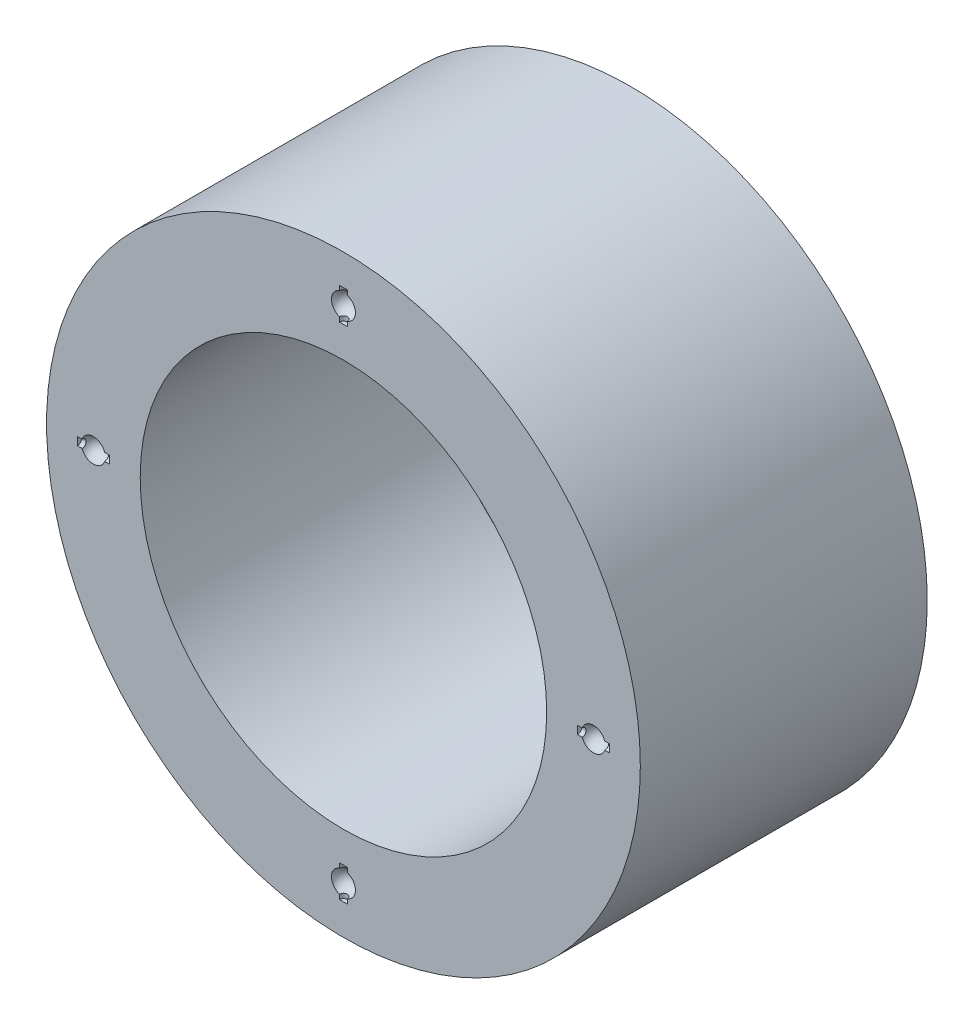
ISO-10303-21;
HEADER;
FILE_DESCRIPTION(('STEP AP214'),'2;1');
FILE_NAME('part.step','',(''),(''),'','','');
FILE_SCHEMA(('AUTOMOTIVE_DESIGN { 1 0 10303 214 1 1 1 1 }'));
ENDSEC;
DATA;
#1=APPLICATION_CONTEXT('core data for automotive mechanical design processes');
#2=APPLICATION_PROTOCOL_DEFINITION('international standard','automotive_design',2000,#1);
#3=PRODUCT_CONTEXT('',#1,'mechanical');
#4=PRODUCT('Part','Part','',(#3));
#5=PRODUCT_RELATED_PRODUCT_CATEGORY('part','',(#4));
#6=PRODUCT_DEFINITION_FORMATION('','',#4);
#7=PRODUCT_DEFINITION_CONTEXT('part definition',#1,'design');
#8=PRODUCT_DEFINITION('design','',#6,#7);
#9=PRODUCT_DEFINITION_SHAPE('','',#8);
#10=(LENGTH_UNIT() NAMED_UNIT(*) SI_UNIT(.MILLI.,.METRE.));
#11=(NAMED_UNIT(*) PLANE_ANGLE_UNIT() SI_UNIT($,.RADIAN.));
#12=(NAMED_UNIT(*) SI_UNIT($,.STERADIAN.) SOLID_ANGLE_UNIT());
#13=UNCERTAINTY_MEASURE_WITH_UNIT(LENGTH_MEASURE(1.E-05),#10,'distance_accuracy_value','');
#14=(GEOMETRIC_REPRESENTATION_CONTEXT(3) GLOBAL_UNCERTAINTY_ASSIGNED_CONTEXT((#13)) GLOBAL_UNIT_ASSIGNED_CONTEXT((#10,
#11,#12)) REPRESENTATION_CONTEXT('',''));
#15=CARTESIAN_POINT('',(0.,0.,0.));
#16=DIRECTION('',(0.,0.,1.));
#17=DIRECTION('',(1.,0.,0.));
#18=AXIS2_PLACEMENT_3D('',#15,#16,#17);
#19=CARTESIAN_POINT('',(0.,0.,72.));
#20=DIRECTION('',(0.,0.,-1.));
#21=DIRECTION('',(-1.,0.,0.));
#22=AXIS2_PLACEMENT_3D('',#19,#20,#21);
#23=CYLINDRICAL_SURFACE('',#22,74.5);
#24=CARTESIAN_POINT('',(0.,0.,72.));
#25=DIRECTION('',(0.,0.,1.));
#26=DIRECTION('',(1.,0.,0.));
#27=AXIS2_PLACEMENT_3D('',#24,#25,#26);
#28=CIRCLE('',#27,74.5);
#29=CARTESIAN_POINT('',(74.5,0.,72.));
#30=VERTEX_POINT('',#29);
#31=EDGE_CURVE('E197',#30,#30,#28,.T.);
#32=ORIENTED_EDGE('',*,*,#31,.F.);
#33=EDGE_LOOP('',(#32));
#34=FACE_BOUND('',#33,.T.);
#35=CARTESIAN_POINT('',(0.,0.,0.));
#36=DIRECTION('',(0.,0.,1.));
#37=DIRECTION('',(1.,0.,0.));
#38=AXIS2_PLACEMENT_3D('',#35,#36,#37);
#39=CIRCLE('',#38,74.5);
#40=CARTESIAN_POINT('',(74.5,0.,0.));
#41=VERTEX_POINT('',#40);
#42=EDGE_CURVE('E213',#41,#41,#39,.T.);
#43=ORIENTED_EDGE('',*,*,#42,.T.);
#44=EDGE_LOOP('',(#43));
#45=FACE_BOUND('',#44,.T.);
#46=ADVANCED_FACE('F33',(#34,#45),#23,.T.);
#47=CARTESIAN_POINT('',(0.,0.,72.));
#48=DIRECTION('',(0.,0.,1.));
#49=DIRECTION('',(1.,0.,0.));
#50=AXIS2_PLACEMENT_3D('',#47,#48,#49);
#51=PLANE('',#50);
#52=DIRECTION('',(1.,0.,0.));
#53=VECTOR('',#52,1.);
#54=CARTESIAN_POINT('',(-58.75,-1.,72.));
#55=LINE('',#54,#53);
#56=CARTESIAN_POINT('',(-59.9215728752538,-1.00000000000001,72.));
#57=VERTEX_POINT('',#56);
#58=CARTESIAN_POINT('',(-58.75,-1.,72.));
#59=VERTEX_POINT('',#58);
#60=EDGE_CURVE('E260',#57,#59,#55,.T.);
#61=ORIENTED_EDGE('',*,*,#60,.F.);
#62=CARTESIAN_POINT('',(-62.75,0.,72.));
#63=DIRECTION('',(0.,0.,1.));
#64=DIRECTION('',(1.,0.,0.));
#65=AXIS2_PLACEMENT_3D('',#62,#63,#64);
#66=CIRCLE('',#65,3.);
#67=CARTESIAN_POINT('',(-65.5784271247462,-0.999999999999992,72.));
#68=VERTEX_POINT('',#67);
#69=EDGE_CURVE('E198',#57,#68,#66,.F.);
#70=ORIENTED_EDGE('',*,*,#69,.T.);
#71=CARTESIAN_POINT('',(-66.75,-1.,72.));
#72=VERTEX_POINT('',#71);
#73=EDGE_CURVE('E55',#72,#68,#55,.T.);
#74=ORIENTED_EDGE('',*,*,#73,.F.);
#75=DIRECTION('',(0.,1.,0.));
#76=VECTOR('',#75,1.);
#77=CARTESIAN_POINT('',(-66.75,0.,72.));
#78=LINE('',#77,#76);
#79=CARTESIAN_POINT('',(-66.75,0.999999999999999,72.));
#80=VERTEX_POINT('',#79);
#81=EDGE_CURVE('E40',#72,#80,#78,.T.);
#82=ORIENTED_EDGE('',*,*,#81,.T.);
#83=DIRECTION('',(1.,0.,0.));
#84=VECTOR('',#83,1.);
#85=CARTESIAN_POINT('',(-58.75,1.,72.));
#86=LINE('',#85,#84);
#87=CARTESIAN_POINT('',(-65.5784271247462,0.999999999999989,72.));
#88=VERTEX_POINT('',#87);
#89=EDGE_CURVE('E145',#88,#80,#86,.F.);
#90=ORIENTED_EDGE('',*,*,#89,.F.);
#91=CARTESIAN_POINT('',(-59.9215728752538,1.00000000000001,72.));
#92=VERTEX_POINT('',#91);
#93=EDGE_CURVE('E201',#88,#92,#66,.F.);
#94=ORIENTED_EDGE('',*,*,#93,.T.);
#95=CARTESIAN_POINT('',(-58.75,1.,72.));
#96=VERTEX_POINT('',#95);
#97=EDGE_CURVE('E47',#96,#92,#86,.F.);
#98=ORIENTED_EDGE('',*,*,#97,.F.);
#99=DIRECTION('',(0.,-1.,0.));
#100=VECTOR('',#99,1.);
#101=CARTESIAN_POINT('',(-58.75,0.,72.));
#102=LINE('',#101,#100);
#103=EDGE_CURVE('E11',#96,#59,#102,.T.);
#104=ORIENTED_EDGE('',*,*,#103,.T.);
#105=EDGE_LOOP('',(#61,#70,#74,#82,#90,#94,#98,#104));
#106=FACE_BOUND('',#105,.T.);
#107=DIRECTION('',(-1.,0.,0.));
#108=VECTOR('',#107,1.);
#109=CARTESIAN_POINT('',(58.75,1.,72.));
#110=LINE('',#109,#108);
#111=CARTESIAN_POINT('',(59.9215728752538,1.,72.));
#112=VERTEX_POINT('',#111);
#113=CARTESIAN_POINT('',(58.75,1.,72.));
#114=VERTEX_POINT('',#113);
#115=EDGE_CURVE('E248',#112,#114,#110,.T.);
#116=ORIENTED_EDGE('',*,*,#115,.F.);
#117=CARTESIAN_POINT('',(62.75,0.,72.));
#118=DIRECTION('',(0.,0.,1.));
#119=DIRECTION('',(1.,0.,0.));
#120=AXIS2_PLACEMENT_3D('',#117,#118,#119);
#121=CIRCLE('',#120,3.);
#122=CARTESIAN_POINT('',(65.5784271247462,1.,72.));
#123=VERTEX_POINT('',#122);
#124=EDGE_CURVE('E200',#112,#123,#121,.F.);
#125=ORIENTED_EDGE('',*,*,#124,.T.);
#126=CARTESIAN_POINT('',(66.75,1.,72.));
#127=VERTEX_POINT('',#126);
#128=EDGE_CURVE('E249',#127,#123,#110,.T.);
#129=ORIENTED_EDGE('',*,*,#128,.F.);
#130=DIRECTION('',(0.,-1.,0.));
#131=VECTOR('',#130,1.);
#132=CARTESIAN_POINT('',(66.75,0.,72.));
#133=LINE('',#132,#131);
#134=CARTESIAN_POINT('',(66.75,-1.,72.));
#135=VERTEX_POINT('',#134);
#136=EDGE_CURVE('E170',#127,#135,#133,.T.);
#137=ORIENTED_EDGE('',*,*,#136,.T.);
#138=DIRECTION('',(-1.,0.,0.));
#139=VECTOR('',#138,1.);
#140=CARTESIAN_POINT('',(58.75,-1.,72.));
#141=LINE('',#140,#139);
#142=CARTESIAN_POINT('',(65.5784271247462,-1.,72.));
#143=VERTEX_POINT('',#142);
#144=EDGE_CURVE('E252',#143,#135,#141,.F.);
#145=ORIENTED_EDGE('',*,*,#144,.F.);
#146=CARTESIAN_POINT('',(59.9215728752538,-1.,72.));
#147=VERTEX_POINT('',#146);
#148=EDGE_CURVE('E202',#143,#147,#121,.F.);
#149=ORIENTED_EDGE('',*,*,#148,.T.);
#150=CARTESIAN_POINT('',(58.75,-1.,72.));
#151=VERTEX_POINT('',#150);
#152=EDGE_CURVE('E251',#151,#147,#141,.F.);
#153=ORIENTED_EDGE('',*,*,#152,.F.);
#154=DIRECTION('',(0.,1.,0.));
#155=VECTOR('',#154,1.);
#156=CARTESIAN_POINT('',(58.75,0.,72.));
#157=LINE('',#156,#155);
#158=EDGE_CURVE('E167',#151,#114,#157,.T.);
#159=ORIENTED_EDGE('',*,*,#158,.T.);
#160=EDGE_LOOP('',(#116,#125,#129,#137,#145,#149,#153,#159));
#161=FACE_BOUND('',#160,.T.);
#162=DIRECTION('',(0.,1.,0.));
#163=VECTOR('',#162,1.);
#164=CARTESIAN_POINT('',(1.,-58.75,72.));
#165=LINE('',#164,#163);
#166=CARTESIAN_POINT('',(1.,-59.9215728752538,72.));
#167=VERTEX_POINT('',#166);
#168=CARTESIAN_POINT('',(1.,-58.75,72.));
#169=VERTEX_POINT('',#168);
#170=EDGE_CURVE('E236',#167,#169,#165,.T.);
#171=ORIENTED_EDGE('',*,*,#170,.F.);
#172=CARTESIAN_POINT('',(0.,-62.75,72.));
#173=DIRECTION('',(0.,0.,1.));
#174=DIRECTION('',(1.,0.,0.));
#175=AXIS2_PLACEMENT_3D('',#172,#173,#174);
#176=CIRCLE('',#175,3.);
#177=CARTESIAN_POINT('',(1.,-65.5784271247462,72.));
#178=VERTEX_POINT('',#177);
#179=EDGE_CURVE('E205',#167,#178,#176,.F.);
#180=ORIENTED_EDGE('',*,*,#179,.T.);
#181=CARTESIAN_POINT('',(1.,-66.75,72.));
#182=VERTEX_POINT('',#181);
#183=EDGE_CURVE('E237',#182,#178,#165,.T.);
#184=ORIENTED_EDGE('',*,*,#183,.F.);
#185=DIRECTION('',(-1.,0.,0.));
#186=VECTOR('',#185,1.);
#187=CARTESIAN_POINT('',(0.,-66.75,72.));
#188=LINE('',#187,#186);
#189=CARTESIAN_POINT('',(-0.999999999999999,-66.75,72.));
#190=VERTEX_POINT('',#189);
#191=EDGE_CURVE('E180',#182,#190,#188,.T.);
#192=ORIENTED_EDGE('',*,*,#191,.T.);
#193=DIRECTION('',(0.,1.,0.));
#194=VECTOR('',#193,1.);
#195=CARTESIAN_POINT('',(-1.,-58.75,72.));
#196=LINE('',#195,#194);
#197=CARTESIAN_POINT('',(-0.999999999999999,-65.5784271247462,72.));
#198=VERTEX_POINT('',#197);
#199=EDGE_CURVE('E240',#198,#190,#196,.F.);
#200=ORIENTED_EDGE('',*,*,#199,.F.);
#201=CARTESIAN_POINT('',(-1.,-59.9215728752538,72.));
#202=VERTEX_POINT('',#201);
#203=EDGE_CURVE('E208',#198,#202,#176,.F.);
#204=ORIENTED_EDGE('',*,*,#203,.T.);
#205=CARTESIAN_POINT('',(-1.,-58.75,72.));
#206=VERTEX_POINT('',#205);
#207=EDGE_CURVE('E239',#206,#202,#196,.F.);
#208=ORIENTED_EDGE('',*,*,#207,.F.);
#209=DIRECTION('',(1.,0.,0.));
#210=VECTOR('',#209,1.);
#211=CARTESIAN_POINT('',(0.,-58.75,72.));
#212=LINE('',#211,#210);
#213=EDGE_CURVE('E177',#206,#169,#212,.T.);
#214=ORIENTED_EDGE('',*,*,#213,.T.);
#215=EDGE_LOOP('',(#171,#180,#184,#192,#200,#204,#208,#214));
#216=FACE_BOUND('',#215,.T.);
#217=DIRECTION('',(0.,1.,0.));
#218=VECTOR('',#217,1.);
#219=CARTESIAN_POINT('',(1.,66.75,72.));
#220=LINE('',#219,#218);
#221=CARTESIAN_POINT('',(1.,65.5784271247462,72.));
#222=VERTEX_POINT('',#221);
#223=CARTESIAN_POINT('',(1.,66.75,72.));
#224=VERTEX_POINT('',#223);
#225=EDGE_CURVE('E228',#222,#224,#220,.T.);
#226=ORIENTED_EDGE('',*,*,#225,.F.);
#227=CARTESIAN_POINT('',(0.,62.75,72.));
#228=DIRECTION('',(0.,0.,1.));
#229=DIRECTION('',(1.,0.,0.));
#230=AXIS2_PLACEMENT_3D('',#227,#228,#229);
#231=CIRCLE('',#230,3.);
#232=CARTESIAN_POINT('',(1.,59.9215728752538,72.));
#233=VERTEX_POINT('',#232);
#234=EDGE_CURVE('E209',#222,#233,#231,.F.);
#235=ORIENTED_EDGE('',*,*,#234,.T.);
#236=CARTESIAN_POINT('',(1.,58.75,72.));
#237=VERTEX_POINT('',#236);
#238=EDGE_CURVE('E224',#237,#233,#220,.T.);
#239=ORIENTED_EDGE('',*,*,#238,.F.);
#240=DIRECTION('',(-1.,0.,0.));
#241=VECTOR('',#240,1.);
#242=CARTESIAN_POINT('',(0.,58.75,72.));
#243=LINE('',#242,#241);
#244=CARTESIAN_POINT('',(-0.999999999999999,58.75,72.));
#245=VERTEX_POINT('',#244);
#246=EDGE_CURVE('E190',#237,#245,#243,.T.);
#247=ORIENTED_EDGE('',*,*,#246,.T.);
#248=DIRECTION('',(0.,1.,0.));
#249=VECTOR('',#248,1.);
#250=CARTESIAN_POINT('',(-1.,66.75,72.));
#251=LINE('',#250,#249);
#252=CARTESIAN_POINT('',(-1.,59.9215728752538,72.));
#253=VERTEX_POINT('',#252);
#254=EDGE_CURVE('E227',#253,#245,#251,.F.);
#255=ORIENTED_EDGE('',*,*,#254,.F.);
#256=CARTESIAN_POINT('',(-1.,65.5784271247462,72.));
#257=VERTEX_POINT('',#256);
#258=EDGE_CURVE('E212',#253,#257,#231,.F.);
#259=ORIENTED_EDGE('',*,*,#258,.T.);
#260=CARTESIAN_POINT('',(-1.,66.75,72.));
#261=VERTEX_POINT('',#260);
#262=EDGE_CURVE('E226',#261,#257,#251,.F.);
#263=ORIENTED_EDGE('',*,*,#262,.F.);
#264=DIRECTION('',(1.,0.,0.));
#265=VECTOR('',#264,1.);
#266=CARTESIAN_POINT('',(0.,66.75,72.));
#267=LINE('',#266,#265);
#268=EDGE_CURVE('E187',#261,#224,#267,.T.);
#269=ORIENTED_EDGE('',*,*,#268,.T.);
#270=EDGE_LOOP('',(#226,#235,#239,#247,#255,#259,#263,#269));
#271=FACE_BOUND('',#270,.T.);
#272=CARTESIAN_POINT('',(0.,0.,72.));
#273=DIRECTION('',(0.,0.,1.));
#274=DIRECTION('',(1.,0.,0.));
#275=AXIS2_PLACEMENT_3D('',#272,#273,#274);
#276=CIRCLE('',#275,51.);
#277=CARTESIAN_POINT('',(51.,0.,72.));
#278=VERTEX_POINT('',#277);
#279=EDGE_CURVE('E219',#278,#278,#276,.T.);
#280=ORIENTED_EDGE('',*,*,#279,.F.);
#281=EDGE_LOOP('',(#280));
#282=FACE_BOUND('',#281,.T.);
#283=ORIENTED_EDGE('',*,*,#31,.T.);
#284=EDGE_LOOP('',(#283));
#285=FACE_BOUND('',#284,.T.);
#286=ADVANCED_FACE('F160',(#106,#161,#216,#271,#282,#285),#51,.T.);
#287=CARTESIAN_POINT('',(0.,0.,0.));
#288=DIRECTION('',(0.,0.,1.));
#289=DIRECTION('',(1.,0.,0.));
#290=AXIS2_PLACEMENT_3D('',#287,#288,#289);
#291=PLANE('',#290);
#292=CARTESIAN_POINT('',(0.,0.,0.));
#293=DIRECTION('',(0.,0.,1.));
#294=DIRECTION('',(1.,0.,0.));
#295=AXIS2_PLACEMENT_3D('',#292,#293,#294);
#296=CIRCLE('',#295,51.);
#297=CARTESIAN_POINT('',(51.,0.,0.));
#298=VERTEX_POINT('',#297);
#299=EDGE_CURVE('E216',#298,#298,#296,.T.);
#300=ORIENTED_EDGE('',*,*,#299,.T.);
#301=EDGE_LOOP('',(#300));
#302=FACE_BOUND('',#301,.T.);
#303=ORIENTED_EDGE('',*,*,#42,.F.);
#304=EDGE_LOOP('',(#303));
#305=FACE_BOUND('',#304,.T.);
#306=ADVANCED_FACE('F303',(#302,#305),#291,.F.);
#307=CARTESIAN_POINT('',(0.,0.,0.));
#308=DIRECTION('',(0.,0.,1.));
#309=DIRECTION('',(1.,0.,0.));
#310=AXIS2_PLACEMENT_3D('',#307,#308,#309);
#311=CYLINDRICAL_SURFACE('',#310,51.);
#312=ORIENTED_EDGE('',*,*,#299,.F.);
#313=EDGE_LOOP('',(#312));
#314=FACE_BOUND('',#313,.T.);
#315=ORIENTED_EDGE('',*,*,#279,.T.);
#316=EDGE_LOOP('',(#315));
#317=FACE_BOUND('',#316,.T.);
#318=ADVANCED_FACE('F310',(#314,#317),#311,.F.);
#319=CARTESIAN_POINT('',(0.,62.75,72.));
#320=DIRECTION('',(0.,1.,0.));
#321=DIRECTION('',(1.,0.,0.));
#322=AXIS2_PLACEMENT_3D('',#319,#320,#321);
#323=SPHERICAL_SURFACE('',#322,3.);
#324=CARTESIAN_POINT('',(0.,65.5784271247462,72.));
#325=DIRECTION('',(0.,-1.,0.));
#326=DIRECTION('',(1.,0.,0.));
#327=AXIS2_PLACEMENT_3D('',#324,#325,#326);
#328=CIRCLE('',#327,1.);
#329=EDGE_CURVE('E193',#257,#222,#328,.T.);
#330=ORIENTED_EDGE('',*,*,#329,.F.);
#331=ORIENTED_EDGE('',*,*,#258,.F.);
#332=CARTESIAN_POINT('',(0.,59.9215728752538,72.));
#333=DIRECTION('',(0.,1.,0.));
#334=DIRECTION('',(-1.,0.,0.));
#335=AXIS2_PLACEMENT_3D('',#332,#333,#334);
#336=CIRCLE('',#335,1.);
#337=EDGE_CURVE('E195',#233,#253,#336,.T.);
#338=ORIENTED_EDGE('',*,*,#337,.F.);
#339=ORIENTED_EDGE('',*,*,#234,.F.);
#340=EDGE_LOOP('',(#330,#331,#338,#339));
#341=FACE_BOUND('',#340,.T.);
#342=ADVANCED_FACE('F277',(#341),#323,.F.);
#343=CARTESIAN_POINT('',(0.,-62.75,72.));
#344=DIRECTION('',(0.,1.,0.));
#345=DIRECTION('',(1.,0.,0.));
#346=AXIS2_PLACEMENT_3D('',#343,#344,#345);
#347=SPHERICAL_SURFACE('',#346,3.);
#348=CARTESIAN_POINT('',(0.,-59.9215728752538,72.));
#349=DIRECTION('',(0.,-1.,0.));
#350=DIRECTION('',(1.,0.,0.));
#351=AXIS2_PLACEMENT_3D('',#348,#349,#350);
#352=CIRCLE('',#351,1.);
#353=EDGE_CURVE('E183',#202,#167,#352,.T.);
#354=ORIENTED_EDGE('',*,*,#353,.F.);
#355=ORIENTED_EDGE('',*,*,#203,.F.);
#356=CARTESIAN_POINT('',(0.,-65.5784271247462,72.));
#357=DIRECTION('',(0.,1.,0.));
#358=DIRECTION('',(-1.,0.,0.));
#359=AXIS2_PLACEMENT_3D('',#356,#357,#358);
#360=CIRCLE('',#359,1.);
#361=EDGE_CURVE('E185',#178,#198,#360,.T.);
#362=ORIENTED_EDGE('',*,*,#361,.F.);
#363=ORIENTED_EDGE('',*,*,#179,.F.);
#364=EDGE_LOOP('',(#354,#355,#362,#363));
#365=FACE_BOUND('',#364,.T.);
#366=ADVANCED_FACE('F320',(#365),#347,.F.);
#367=CARTESIAN_POINT('',(62.75,0.,72.));
#368=DIRECTION('',(0.,1.,0.));
#369=DIRECTION('',(1.,0.,0.));
#370=AXIS2_PLACEMENT_3D('',#367,#368,#369);
#371=SPHERICAL_SURFACE('',#370,3.);
#372=CARTESIAN_POINT('',(59.9215728752538,0.,72.));
#373=DIRECTION('',(1.,0.,0.));
#374=DIRECTION('',(0.,0.,-1.));
#375=AXIS2_PLACEMENT_3D('',#372,#373,#374);
#376=CIRCLE('',#375,1.);
#377=EDGE_CURVE('E173',#147,#112,#376,.T.);
#378=ORIENTED_EDGE('',*,*,#377,.F.);
#379=ORIENTED_EDGE('',*,*,#148,.F.);
#380=CARTESIAN_POINT('',(65.5784271247462,0.,72.));
#381=DIRECTION('',(-1.,0.,0.));
#382=DIRECTION('',(0.,0.,1.));
#383=AXIS2_PLACEMENT_3D('',#380,#381,#382);
#384=CIRCLE('',#383,1.);
#385=EDGE_CURVE('E175',#123,#143,#384,.T.);
#386=ORIENTED_EDGE('',*,*,#385,.F.);
#387=ORIENTED_EDGE('',*,*,#124,.F.);
#388=EDGE_LOOP('',(#378,#379,#386,#387));
#389=FACE_BOUND('',#388,.T.);
#390=ADVANCED_FACE('F323',(#389),#371,.F.);
#391=CARTESIAN_POINT('',(-62.75,0.,72.));
#392=DIRECTION('',(0.,1.,0.));
#393=DIRECTION('',(1.,0.,0.));
#394=AXIS2_PLACEMENT_3D('',#391,#392,#393);
#395=SPHERICAL_SURFACE('',#394,3.);
#396=CARTESIAN_POINT('',(-59.9215728752538,0.,72.));
#397=DIRECTION('',(-0.999999999999999,0.,0.));
#398=DIRECTION('',(0.,-1.,0.));
#399=AXIS2_PLACEMENT_3D('',#396,#397,#398);
#400=CIRCLE('',#399,1.);
#401=EDGE_CURVE('E163',#92,#57,#400,.T.);
#402=ORIENTED_EDGE('',*,*,#401,.F.);
#403=ORIENTED_EDGE('',*,*,#93,.F.);
#404=CARTESIAN_POINT('',(-65.5784271247462,0.,72.));
#405=DIRECTION('',(0.999999999999999,0.,0.));
#406=DIRECTION('',(0.,1.,0.));
#407=AXIS2_PLACEMENT_3D('',#404,#405,#406);
#408=CIRCLE('',#407,1.);
#409=EDGE_CURVE('E149',#68,#88,#408,.T.);
#410=ORIENTED_EDGE('',*,*,#409,.F.);
#411=ORIENTED_EDGE('',*,*,#69,.F.);
#412=EDGE_LOOP('',(#402,#403,#410,#411));
#413=FACE_BOUND('',#412,.T.);
#414=ADVANCED_FACE('F295',(#413),#395,.F.);
#415=CARTESIAN_POINT('',(0.,66.75,72.));
#416=DIRECTION('',(0.,1.,0.));
#417=DIRECTION('',(-1.,0.,0.));
#418=AXIS2_PLACEMENT_3D('',#415,#416,#417);
#419=CYLINDRICAL_SURFACE('',#418,1.);
#420=ORIENTED_EDGE('',*,*,#238,.T.);
#421=ORIENTED_EDGE('',*,*,#337,.T.);
#422=ORIENTED_EDGE('',*,*,#254,.T.);
#423=CARTESIAN_POINT('',(0.,58.75,72.));
#424=DIRECTION('',(0.,1.,0.));
#425=DIRECTION('',(-1.,0.,0.));
#426=AXIS2_PLACEMENT_3D('',#423,#424,#425);
#427=CIRCLE('',#426,1.);
#428=EDGE_CURVE('E233',#237,#245,#427,.T.);
#429=ORIENTED_EDGE('',*,*,#428,.F.);
#430=EDGE_LOOP('',(#420,#421,#422,#429));
#431=FACE_BOUND('',#430,.T.);
#432=ADVANCED_FACE('F284',(#431),#419,.F.);
#433=CARTESIAN_POINT('',(0.,58.75,72.));
#434=DIRECTION('',(0.,1.,0.));
#435=DIRECTION('',(-1.,0.,0.));
#436=AXIS2_PLACEMENT_3D('',#433,#434,#435);
#437=PLANE('',#436);
#438=ORIENTED_EDGE('',*,*,#428,.T.);
#439=ORIENTED_EDGE('',*,*,#246,.F.);
#440=EDGE_LOOP('',(#438,#439));
#441=FACE_BOUND('',#440,.T.);
#442=ADVANCED_FACE('F286',(#441),#437,.T.);
#443=ORIENTED_EDGE('',*,*,#225,.T.);
#444=CARTESIAN_POINT('',(0.,66.75,72.));
#445=DIRECTION('',(0.,1.,0.));
#446=DIRECTION('',(-1.,0.,0.));
#447=AXIS2_PLACEMENT_3D('',#444,#445,#446);
#448=CIRCLE('',#447,1.);
#449=EDGE_CURVE('E230',#224,#261,#448,.T.);
#450=ORIENTED_EDGE('',*,*,#449,.T.);
#451=ORIENTED_EDGE('',*,*,#262,.T.);
#452=ORIENTED_EDGE('',*,*,#329,.T.);
#453=EDGE_LOOP('',(#443,#450,#451,#452));
#454=FACE_BOUND('',#453,.T.);
#455=ADVANCED_FACE('F271',(#454),#419,.F.);
#456=CARTESIAN_POINT('',(-1.,66.75,72.));
#457=DIRECTION('',(0.,-1.,0.));
#458=DIRECTION('',(1.,0.,0.));
#459=AXIS2_PLACEMENT_3D('',#456,#457,#458);
#460=PLANE('',#459);
#461=ORIENTED_EDGE('',*,*,#449,.F.);
#462=ORIENTED_EDGE('',*,*,#268,.F.);
#463=EDGE_LOOP('',(#461,#462));
#464=FACE_BOUND('',#463,.T.);
#465=ADVANCED_FACE('F293',(#464),#460,.T.);
#466=CARTESIAN_POINT('',(0.,-58.75,72.));
#467=DIRECTION('',(0.,1.,0.));
#468=DIRECTION('',(-1.,0.,0.));
#469=AXIS2_PLACEMENT_3D('',#466,#467,#468);
#470=CYLINDRICAL_SURFACE('',#469,1.);
#471=ORIENTED_EDGE('',*,*,#183,.T.);
#472=ORIENTED_EDGE('',*,*,#361,.T.);
#473=ORIENTED_EDGE('',*,*,#199,.T.);
#474=CARTESIAN_POINT('',(0.,-66.75,72.));
#475=DIRECTION('',(0.,1.,0.));
#476=DIRECTION('',(-1.,0.,0.));
#477=AXIS2_PLACEMENT_3D('',#474,#475,#476);
#478=CIRCLE('',#477,1.);
#479=EDGE_CURVE('E245',#182,#190,#478,.T.);
#480=ORIENTED_EDGE('',*,*,#479,.F.);
#481=EDGE_LOOP('',(#471,#472,#473,#480));
#482=FACE_BOUND('',#481,.T.);
#483=ADVANCED_FACE('F330',(#482),#470,.F.);
#484=CARTESIAN_POINT('',(0.,-66.75,72.));
#485=DIRECTION('',(0.,1.,0.));
#486=DIRECTION('',(-1.,0.,0.));
#487=AXIS2_PLACEMENT_3D('',#484,#485,#486);
#488=PLANE('',#487);
#489=ORIENTED_EDGE('',*,*,#479,.T.);
#490=ORIENTED_EDGE('',*,*,#191,.F.);
#491=EDGE_LOOP('',(#489,#490));
#492=FACE_BOUND('',#491,.T.);
#493=ADVANCED_FACE('F335',(#492),#488,.T.);
#494=ORIENTED_EDGE('',*,*,#170,.T.);
#495=CARTESIAN_POINT('',(0.,-58.75,72.));
#496=DIRECTION('',(0.,1.,0.));
#497=DIRECTION('',(-1.,0.,0.));
#498=AXIS2_PLACEMENT_3D('',#495,#496,#497);
#499=CIRCLE('',#498,1.);
#500=EDGE_CURVE('E242',#169,#206,#499,.T.);
#501=ORIENTED_EDGE('',*,*,#500,.T.);
#502=ORIENTED_EDGE('',*,*,#207,.T.);
#503=ORIENTED_EDGE('',*,*,#353,.T.);
#504=EDGE_LOOP('',(#494,#501,#502,#503));
#505=FACE_BOUND('',#504,.T.);
#506=ADVANCED_FACE('F337',(#505),#470,.F.);
#507=CARTESIAN_POINT('',(-1.,-58.75,72.));
#508=DIRECTION('',(0.,-1.,0.));
#509=DIRECTION('',(1.,0.,0.));
#510=AXIS2_PLACEMENT_3D('',#507,#508,#509);
#511=PLANE('',#510);
#512=ORIENTED_EDGE('',*,*,#500,.F.);
#513=ORIENTED_EDGE('',*,*,#213,.F.);
#514=EDGE_LOOP('',(#512,#513));
#515=FACE_BOUND('',#514,.T.);
#516=ADVANCED_FACE('F345',(#515),#511,.T.);
#517=CARTESIAN_POINT('',(58.75,0.,72.));
#518=DIRECTION('',(-1.,0.,0.));
#519=DIRECTION('',(0.,0.,1.));
#520=AXIS2_PLACEMENT_3D('',#517,#518,#519);
#521=CYLINDRICAL_SURFACE('',#520,1.);
#522=ORIENTED_EDGE('',*,*,#128,.T.);
#523=ORIENTED_EDGE('',*,*,#385,.T.);
#524=ORIENTED_EDGE('',*,*,#144,.T.);
#525=CARTESIAN_POINT('',(66.75,0.,72.));
#526=DIRECTION('',(-1.,0.,0.));
#527=DIRECTION('',(0.,0.,1.));
#528=AXIS2_PLACEMENT_3D('',#525,#526,#527);
#529=CIRCLE('',#528,1.);
#530=EDGE_CURVE('E257',#127,#135,#529,.T.);
#531=ORIENTED_EDGE('',*,*,#530,.F.);
#532=EDGE_LOOP('',(#522,#523,#524,#531));
#533=FACE_BOUND('',#532,.T.);
#534=ADVANCED_FACE('F350',(#533),#521,.F.);
#535=CARTESIAN_POINT('',(66.75,0.,72.));
#536=DIRECTION('',(-1.,0.,0.));
#537=DIRECTION('',(0.,0.,1.));
#538=AXIS2_PLACEMENT_3D('',#535,#536,#537);
#539=PLANE('',#538);
#540=ORIENTED_EDGE('',*,*,#530,.T.);
#541=ORIENTED_EDGE('',*,*,#136,.F.);
#542=EDGE_LOOP('',(#540,#541));
#543=FACE_BOUND('',#542,.T.);
#544=ADVANCED_FACE('F367',(#543),#539,.T.);
#545=ORIENTED_EDGE('',*,*,#115,.T.);
#546=CARTESIAN_POINT('',(58.75,0.,72.));
#547=DIRECTION('',(-1.,0.,0.));
#548=DIRECTION('',(0.,0.,1.));
#549=AXIS2_PLACEMENT_3D('',#546,#547,#548);
#550=CIRCLE('',#549,1.);
#551=EDGE_CURVE('E254',#114,#151,#550,.T.);
#552=ORIENTED_EDGE('',*,*,#551,.T.);
#553=ORIENTED_EDGE('',*,*,#152,.T.);
#554=ORIENTED_EDGE('',*,*,#377,.T.);
#555=EDGE_LOOP('',(#545,#552,#553,#554));
#556=FACE_BOUND('',#555,.T.);
#557=ADVANCED_FACE('F370',(#556),#521,.F.);
#558=CARTESIAN_POINT('',(58.75,-1.,72.));
#559=DIRECTION('',(1.,0.,0.));
#560=DIRECTION('',(0.,0.,-1.));
#561=AXIS2_PLACEMENT_3D('',#558,#559,#560);
#562=PLANE('',#561);
#563=ORIENTED_EDGE('',*,*,#551,.F.);
#564=ORIENTED_EDGE('',*,*,#158,.F.);
#565=EDGE_LOOP('',(#563,#564));
#566=FACE_BOUND('',#565,.T.);
#567=ADVANCED_FACE('F372',(#566),#562,.T.);
#568=CARTESIAN_POINT('',(-58.75,0.,72.));
#569=DIRECTION('',(1.,0.,0.));
#570=DIRECTION('',(0.,1.,0.));
#571=AXIS2_PLACEMENT_3D('',#568,#569,#570);
#572=CYLINDRICAL_SURFACE('',#571,1.);
#573=ORIENTED_EDGE('',*,*,#73,.T.);
#574=ORIENTED_EDGE('',*,*,#409,.T.);
#575=ORIENTED_EDGE('',*,*,#89,.T.);
#576=CARTESIAN_POINT('',(-66.75,0.,72.));
#577=DIRECTION('',(1.,0.,0.));
#578=DIRECTION('',(0.,1.,0.));
#579=AXIS2_PLACEMENT_3D('',#576,#577,#578);
#580=CIRCLE('',#579,1.);
#581=EDGE_CURVE('E148',#72,#80,#580,.T.);
#582=ORIENTED_EDGE('',*,*,#581,.F.);
#583=EDGE_LOOP('',(#573,#574,#575,#582));
#584=FACE_BOUND('',#583,.T.);
#585=ADVANCED_FACE('F147',(#584),#572,.F.);
#586=CARTESIAN_POINT('',(-66.75,0.,72.));
#587=DIRECTION('',(1.,0.,0.));
#588=DIRECTION('',(0.,1.,0.));
#589=AXIS2_PLACEMENT_3D('',#586,#587,#588);
#590=PLANE('',#589);
#591=ORIENTED_EDGE('',*,*,#581,.T.);
#592=ORIENTED_EDGE('',*,*,#81,.F.);
#593=EDGE_LOOP('',(#591,#592));
#594=FACE_BOUND('',#593,.T.);
#595=ADVANCED_FACE('F157',(#594),#590,.T.);
#596=ORIENTED_EDGE('',*,*,#60,.T.);
#597=CARTESIAN_POINT('',(-58.75,0.,72.));
#598=DIRECTION('',(1.,0.,0.));
#599=DIRECTION('',(0.,1.,0.));
#600=AXIS2_PLACEMENT_3D('',#597,#598,#599);
#601=CIRCLE('',#600,1.);
#602=EDGE_CURVE('E154',#59,#96,#601,.T.);
#603=ORIENTED_EDGE('',*,*,#602,.T.);
#604=ORIENTED_EDGE('',*,*,#97,.T.);
#605=ORIENTED_EDGE('',*,*,#401,.T.);
#606=EDGE_LOOP('',(#596,#603,#604,#605));
#607=FACE_BOUND('',#606,.T.);
#608=ADVANCED_FACE('F263',(#607),#572,.F.);
#609=CARTESIAN_POINT('',(-58.75,1.,72.));
#610=DIRECTION('',(-1.,0.,0.));
#611=DIRECTION('',(0.,-1.,0.));
#612=AXIS2_PLACEMENT_3D('',#609,#610,#611);
#613=PLANE('',#612);
#614=ORIENTED_EDGE('',*,*,#602,.F.);
#615=ORIENTED_EDGE('',*,*,#103,.F.);
#616=EDGE_LOOP('',(#614,#615));
#617=FACE_BOUND('',#616,.T.);
#618=ADVANCED_FACE('F381',(#617),#613,.T.);
#619=CLOSED_SHELL('',(#46,#286,#306,#318,#342,#366,#390,#414,#432,#442,#455,#465,#483,#493,#506,
#516,#534,#544,#557,#567,#585,#595,#608,#618));
#620=MANIFOLD_SOLID_BREP('B2',#619);
#621=ADVANCED_BREP_SHAPE_REPRESENTATION('',(#18,#620),#14);
#622=SHAPE_DEFINITION_REPRESENTATION(#9,#621);
ENDSEC;
END-ISO-10303-21;
